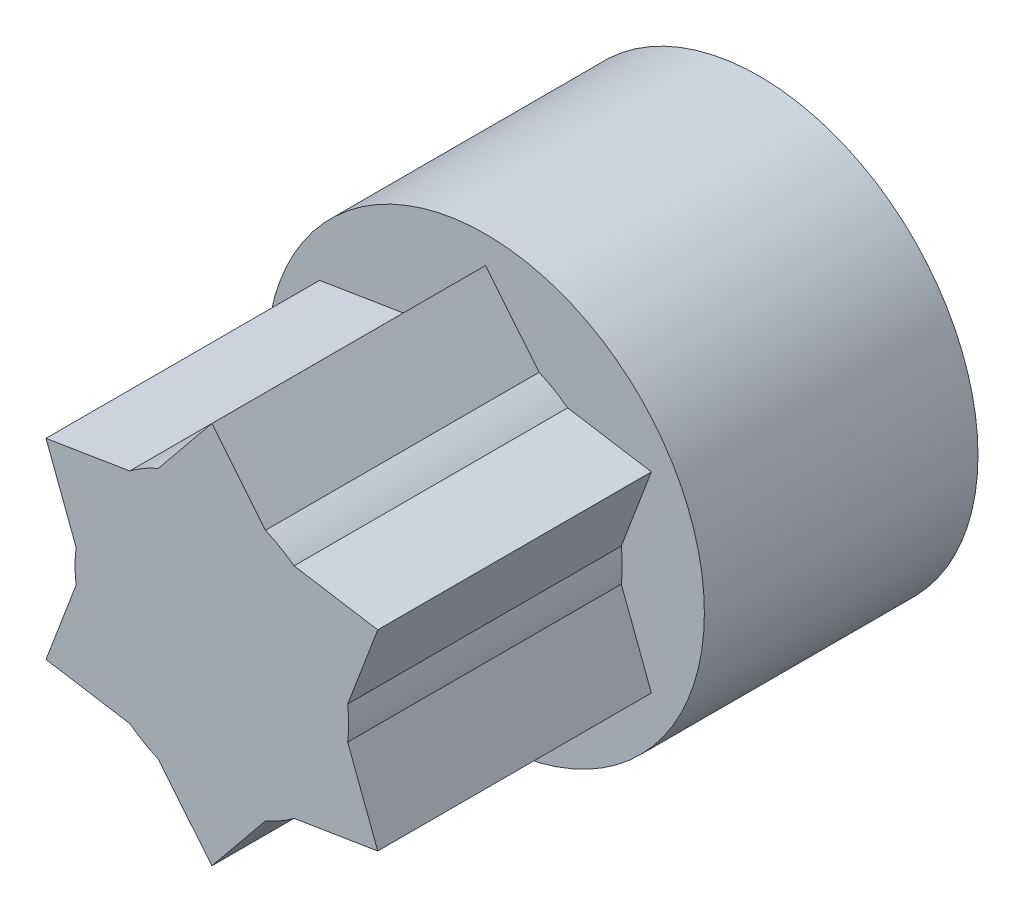
ISO-10303-21;
HEADER;
FILE_DESCRIPTION(('STEP AP214'),'2;1');
FILE_NAME('part.step','',(''),(''),'','','');
FILE_SCHEMA(('AUTOMOTIVE_DESIGN { 1 0 10303 214 1 1 1 1 }'));
ENDSEC;
DATA;
#1=APPLICATION_CONTEXT('core data for automotive mechanical design processes');
#2=APPLICATION_PROTOCOL_DEFINITION('international standard','automotive_design',2000,#1);
#3=PRODUCT_CONTEXT('',#1,'mechanical');
#4=PRODUCT('Part','Part','',(#3));
#5=PRODUCT_RELATED_PRODUCT_CATEGORY('part','',(#4));
#6=PRODUCT_DEFINITION_FORMATION('','',#4);
#7=PRODUCT_DEFINITION_CONTEXT('part definition',#1,'design');
#8=PRODUCT_DEFINITION('design','',#6,#7);
#9=PRODUCT_DEFINITION_SHAPE('','',#8);
#10=(LENGTH_UNIT() NAMED_UNIT(*) SI_UNIT(.MILLI.,.METRE.));
#11=(NAMED_UNIT(*) PLANE_ANGLE_UNIT() SI_UNIT($,.RADIAN.));
#12=(NAMED_UNIT(*) SI_UNIT($,.STERADIAN.) SOLID_ANGLE_UNIT());
#13=UNCERTAINTY_MEASURE_WITH_UNIT(LENGTH_MEASURE(1.E-05),#10,'distance_accuracy_value','');
#14=(GEOMETRIC_REPRESENTATION_CONTEXT(3) GLOBAL_UNCERTAINTY_ASSIGNED_CONTEXT((#13)) GLOBAL_UNIT_ASSIGNED_CONTEXT((#10,
#11,#12)) REPRESENTATION_CONTEXT('',''));
#15=CARTESIAN_POINT('',(0.,0.,0.));
#16=DIRECTION('',(0.,0.,1.));
#17=DIRECTION('',(1.,0.,0.));
#18=AXIS2_PLACEMENT_3D('',#15,#16,#17);
#19=CARTESIAN_POINT('',(-1.71464281994822,1.4,36.602998));
#20=DIRECTION('',(-0.774596669241484,0.632455532033676,0.));
#21=DIRECTION('',(-0.632455532033676,-0.774596669241484,0.));
#22=AXIS2_PLACEMENT_3D('',#19,#20,#21);
#23=PLANE('',#22);
#24=DIRECTION('',(0.632455532033676,0.774596669241483,0.));
#25=VECTOR('',#24,1.);
#26=CARTESIAN_POINT('',(-1.71464281994822,1.4,31.602998));
#27=LINE('',#26,#25);
#28=CARTESIAN_POINT('',(-0.979795897113271,2.3,31.602998));
#29=VERTEX_POINT('',#28);
#30=CARTESIAN_POINT('',(0.,3.5,31.602998));
#31=VERTEX_POINT('',#30);
#32=EDGE_CURVE('E160',#29,#31,#27,.T.);
#33=ORIENTED_EDGE('',*,*,#32,.F.);
#34=DIRECTION('',(0.,0.,-1.));
#35=VECTOR('',#34,1.);
#36=CARTESIAN_POINT('',(-0.979795897113271,2.3,36.602998));
#37=LINE('',#36,#35);
#38=CARTESIAN_POINT('',(-0.979795897113271,2.3,36.602998));
#39=VERTEX_POINT('',#38);
#40=EDGE_CURVE('E11',#39,#29,#37,.T.);
#41=ORIENTED_EDGE('',*,*,#40,.F.);
#42=DIRECTION('',(0.632455532033676,0.774596669241483,0.));
#43=VECTOR('',#42,1.);
#44=CARTESIAN_POINT('',(-1.71464281994822,1.4,36.602998));
#45=LINE('',#44,#43);
#46=CARTESIAN_POINT('',(0.,3.5,36.602998));
#47=VERTEX_POINT('',#46);
#48=EDGE_CURVE('E213',#39,#47,#45,.T.);
#49=ORIENTED_EDGE('',*,*,#48,.T.);
#50=DIRECTION('',(0.,0.,-1.));
#51=VECTOR('',#50,1.);
#52=CARTESIAN_POINT('',(0.,3.5,36.602998));
#53=LINE('',#52,#51);
#54=EDGE_CURVE('E175',#47,#31,#53,.T.);
#55=ORIENTED_EDGE('',*,*,#54,.T.);
#56=EDGE_LOOP('',(#33,#41,#49,#55));
#57=FACE_BOUND('',#56,.T.);
#58=ADVANCED_FACE('F37',(#57),#23,.T.);
#59=CARTESIAN_POINT('',(0.,0.,36.602998));
#60=DIRECTION('',(0.,0.,-1.));
#61=DIRECTION('',(-1.,0.,0.));
#62=AXIS2_PLACEMENT_3D('',#59,#60,#61);
#63=CYLINDRICAL_SURFACE('',#62,2.5);
#64=CARTESIAN_POINT('',(0.,0.,31.602998));
#65=DIRECTION('',(0.,0.,1.));
#66=DIRECTION('',(1.,0.,0.));
#67=AXIS2_PLACEMENT_3D('',#64,#65,#66);
#68=CIRCLE('',#67,2.5);
#69=CARTESIAN_POINT('',(-1.50196048014755,1.99852813742387,31.602998));
#70=VERTEX_POINT('',#69);
#71=EDGE_CURVE('E157',#29,#70,#68,.T.);
#72=ORIENTED_EDGE('',*,*,#71,.T.);
#73=DIRECTION('',(0.,0.,-1.));
#74=VECTOR('',#73,1.);
#75=CARTESIAN_POINT('',(-1.50196048014755,1.99852813742387,36.602998));
#76=LINE('',#75,#74);
#77=CARTESIAN_POINT('',(-1.50196048014755,1.99852813742387,36.602998));
#78=VERTEX_POINT('',#77);
#79=EDGE_CURVE('E45',#78,#70,#76,.T.);
#80=ORIENTED_EDGE('',*,*,#79,.F.);
#81=CARTESIAN_POINT('',(0.,0.,36.602998));
#82=DIRECTION('',(0.,0.,1.));
#83=DIRECTION('',(1.,0.,0.));
#84=AXIS2_PLACEMENT_3D('',#81,#82,#83);
#85=CIRCLE('',#84,2.5);
#86=EDGE_CURVE('E172',#39,#78,#85,.T.);
#87=ORIENTED_EDGE('',*,*,#86,.F.);
#88=ORIENTED_EDGE('',*,*,#40,.T.);
#89=EDGE_LOOP('',(#72,#80,#87,#88));
#90=FACE_BOUND('',#89,.T.);
#91=ADVANCED_FACE('F171',(#90),#63,.T.);
#92=CARTESIAN_POINT('',(-0.355114155324076,2.18492424049175,36.602998));
#93=DIRECTION('',(0.160424222884413,-0.987048159266777,0.));
#94=DIRECTION('',(0.987048159266777,0.160424222884413,0.));
#95=AXIS2_PLACEMENT_3D('',#92,#93,#94);
#96=PLANE('',#95);
#97=DIRECTION('',(-0.987048159266777,-0.160424222884413,0.));
#98=VECTOR('',#97,1.);
#99=CARTESIAN_POINT('',(-0.355114155324076,2.18492424049175,31.602998));
#100=LINE('',#99,#98);
#101=CARTESIAN_POINT('',(-3.03108891324552,1.75000000000004,31.602998));
#102=VERTEX_POINT('',#101);
#103=EDGE_CURVE('E163',#70,#102,#100,.T.);
#104=ORIENTED_EDGE('',*,*,#103,.T.);
#105=DIRECTION('',(0.,0.,-1.));
#106=VECTOR('',#105,1.);
#107=CARTESIAN_POINT('',(-3.03108891324552,1.75000000000004,36.602998));
#108=LINE('',#107,#106);
#109=CARTESIAN_POINT('',(-3.03108891324552,1.75000000000004,36.602998));
#110=VERTEX_POINT('',#109);
#111=EDGE_CURVE('E257',#110,#102,#108,.T.);
#112=ORIENTED_EDGE('',*,*,#111,.F.);
#113=DIRECTION('',(-0.987048159266777,-0.160424222884413,0.));
#114=VECTOR('',#113,1.);
#115=CARTESIAN_POINT('',(-0.355114155324076,2.18492424049175,36.602998));
#116=LINE('',#115,#114);
#117=EDGE_CURVE('E263',#78,#110,#116,.T.);
#118=ORIENTED_EDGE('',*,*,#117,.F.);
#119=ORIENTED_EDGE('',*,*,#79,.T.);
#120=EDGE_LOOP('',(#104,#112,#118,#119));
#121=FACE_BOUND('',#120,.T.);
#122=ADVANCED_FACE('F261',(#121),#96,.F.);
#123=CARTESIAN_POINT('',(-2.06975697527233,-0.784924240491726,36.602998));
#124=DIRECTION('',(-0.935020892125912,-0.354592627233088,0.));
#125=DIRECTION('',(0.354592627233088,-0.935020892125912,0.));
#126=AXIS2_PLACEMENT_3D('',#123,#124,#125);
#127=PLANE('',#126);
#128=DIRECTION('',(-0.354592627233088,0.935020892125912,0.));
#129=VECTOR('',#128,1.);
#130=CARTESIAN_POINT('',(-2.06975697527233,-0.784924240491726,31.602998));
#131=LINE('',#130,#129);
#132=CARTESIAN_POINT('',(-2.48175637726084,0.301471862576172,31.602998));
#133=VERTEX_POINT('',#132);
#134=EDGE_CURVE('E186',#133,#102,#131,.T.);
#135=ORIENTED_EDGE('',*,*,#134,.F.);
#136=DIRECTION('',(0.,0.,-1.));
#137=VECTOR('',#136,1.);
#138=CARTESIAN_POINT('',(-2.48175637726084,0.301471862576172,36.602998));
#139=LINE('',#138,#137);
#140=CARTESIAN_POINT('',(-2.48175637726084,0.301471862576172,36.602998));
#141=VERTEX_POINT('',#140);
#142=EDGE_CURVE('E254',#141,#133,#139,.T.);
#143=ORIENTED_EDGE('',*,*,#142,.F.);
#144=DIRECTION('',(-0.354592627233088,0.935020892125912,0.));
#145=VECTOR('',#144,1.);
#146=CARTESIAN_POINT('',(-2.06975697527233,-0.784924240491726,36.602998));
#147=LINE('',#146,#145);
#148=EDGE_CURVE('E266',#141,#110,#147,.T.);
#149=ORIENTED_EDGE('',*,*,#148,.T.);
#150=ORIENTED_EDGE('',*,*,#111,.T.);
#151=EDGE_LOOP('',(#135,#143,#149,#150));
#152=FACE_BOUND('',#151,.T.);
#153=ADVANCED_FACE('F381',(#152),#127,.T.);
#154=CARTESIAN_POINT('',(-2.48175637726085,-0.30147186257612,31.602998));
#155=VERTEX_POINT('',#154);
#156=EDGE_CURVE('E169',#133,#155,#68,.T.);
#157=ORIENTED_EDGE('',*,*,#156,.T.);
#158=DIRECTION('',(0.,0.,-1.));
#159=VECTOR('',#158,1.);
#160=CARTESIAN_POINT('',(-2.48175637726085,-0.30147186257612,36.602998));
#161=LINE('',#160,#159);
#162=CARTESIAN_POINT('',(-2.48175637726085,-0.30147186257612,36.602998));
#163=VERTEX_POINT('',#162);
#164=EDGE_CURVE('E251',#163,#155,#161,.T.);
#165=ORIENTED_EDGE('',*,*,#164,.F.);
#166=EDGE_CURVE('E268',#141,#163,#85,.T.);
#167=ORIENTED_EDGE('',*,*,#166,.F.);
#168=ORIENTED_EDGE('',*,*,#142,.T.);
#169=EDGE_LOOP('',(#157,#165,#167,#168));
#170=FACE_BOUND('',#169,.T.);
#171=ADVANCED_FACE('F315',(#170),#63,.T.);
#172=CARTESIAN_POINT('',(-2.06975697527232,0.784924240491769,36.602998));
#173=DIRECTION('',(0.935020892125905,-0.354592627233108,0.));
#174=DIRECTION('',(0.354592627233108,0.935020892125905,0.));
#175=AXIS2_PLACEMENT_3D('',#172,#173,#174);
#176=PLANE('',#175);
#177=DIRECTION('',(-0.354592627233108,-0.935020892125904,0.));
#178=VECTOR('',#177,1.);
#179=CARTESIAN_POINT('',(-2.06975697527232,0.784924240491769,31.602998));
#180=LINE('',#179,#178);
#181=CARTESIAN_POINT('',(-3.03108891324555,-1.74999999999997,31.602998));
#182=VERTEX_POINT('',#181);
#183=EDGE_CURVE('E188',#155,#182,#180,.T.);
#184=ORIENTED_EDGE('',*,*,#183,.T.);
#185=DIRECTION('',(0.,0.,-1.));
#186=VECTOR('',#185,1.);
#187=CARTESIAN_POINT('',(-3.03108891324555,-1.74999999999997,36.602998));
#188=LINE('',#187,#186);
#189=CARTESIAN_POINT('',(-3.03108891324555,-1.74999999999997,36.602998));
#190=VERTEX_POINT('',#189);
#191=EDGE_CURVE('E248',#190,#182,#188,.T.);
#192=ORIENTED_EDGE('',*,*,#191,.F.);
#193=DIRECTION('',(-0.354592627233108,-0.935020892125904,0.));
#194=VECTOR('',#193,1.);
#195=CARTESIAN_POINT('',(-2.06975697527232,0.784924240491769,36.602998));
#196=LINE('',#195,#194);
#197=EDGE_CURVE('E274',#163,#190,#196,.T.);
#198=ORIENTED_EDGE('',*,*,#197,.F.);
#199=ORIENTED_EDGE('',*,*,#164,.T.);
#200=EDGE_LOOP('',(#184,#192,#198,#199));
#201=FACE_BOUND('',#200,.T.);
#202=ADVANCED_FACE('F317',(#201),#176,.F.);
#203=CARTESIAN_POINT('',(-0.355114155324123,-2.18492424049175,36.602998));
#204=DIRECTION('',(-0.160424222884434,-0.987048159266773,0.));
#205=DIRECTION('',(0.987048159266773,-0.160424222884434,0.));
#206=AXIS2_PLACEMENT_3D('',#203,#204,#205);
#207=PLANE('',#206);
#208=DIRECTION('',(-0.987048159266773,0.160424222884434,0.));
#209=VECTOR('',#208,1.);
#210=CARTESIAN_POINT('',(-0.355114155324123,-2.18492424049175,31.602998));
#211=LINE('',#210,#209);
#212=CARTESIAN_POINT('',(-1.50196048014759,-1.99852813742384,31.602998));
#213=VERTEX_POINT('',#212);
#214=EDGE_CURVE('E191',#213,#182,#211,.T.);
#215=ORIENTED_EDGE('',*,*,#214,.F.);
#216=DIRECTION('',(0.,0.,-1.));
#217=VECTOR('',#216,1.);
#218=CARTESIAN_POINT('',(-1.50196048014759,-1.99852813742384,36.602998));
#219=LINE('',#218,#217);
#220=CARTESIAN_POINT('',(-1.50196048014759,-1.99852813742384,36.602998));
#221=VERTEX_POINT('',#220);
#222=EDGE_CURVE('E245',#221,#213,#219,.T.);
#223=ORIENTED_EDGE('',*,*,#222,.F.);
#224=DIRECTION('',(-0.987048159266773,0.160424222884434,0.));
#225=VECTOR('',#224,1.);
#226=CARTESIAN_POINT('',(-0.355114155324123,-2.18492424049175,36.602998));
#227=LINE('',#226,#225);
#228=EDGE_CURVE('E276',#221,#190,#227,.T.);
#229=ORIENTED_EDGE('',*,*,#228,.T.);
#230=ORIENTED_EDGE('',*,*,#191,.T.);
#231=EDGE_LOOP('',(#215,#223,#229,#230));
#232=FACE_BOUND('',#231,.T.);
#233=ADVANCED_FACE('F320',(#232),#207,.T.);
#234=CARTESIAN_POINT('',(-0.979795897113287,-2.29999999999999,31.602998));
#235=VERTEX_POINT('',#234);
#236=EDGE_CURVE('E193',#213,#235,#68,.T.);
#237=ORIENTED_EDGE('',*,*,#236,.T.);
#238=DIRECTION('',(0.,0.,-1.));
#239=VECTOR('',#238,1.);
#240=CARTESIAN_POINT('',(-0.979795897113287,-2.29999999999999,36.602998));
#241=LINE('',#240,#239);
#242=CARTESIAN_POINT('',(-0.979795897113287,-2.29999999999999,36.602998));
#243=VERTEX_POINT('',#242);
#244=EDGE_CURVE('E242',#243,#235,#241,.T.);
#245=ORIENTED_EDGE('',*,*,#244,.F.);
#246=EDGE_CURVE('E279',#221,#243,#85,.T.);
#247=ORIENTED_EDGE('',*,*,#246,.F.);
#248=ORIENTED_EDGE('',*,*,#222,.T.);
#249=EDGE_LOOP('',(#237,#245,#247,#248));
#250=FACE_BOUND('',#249,.T.);
#251=ADVANCED_FACE('F323',(#250),#63,.T.);
#252=CARTESIAN_POINT('',(-1.71464281994823,-1.39999999999999,36.602998));
#253=DIRECTION('',(0.774596669241488,0.63245553203367,0.));
#254=DIRECTION('',(-0.63245553203367,0.774596669241488,0.));
#255=AXIS2_PLACEMENT_3D('',#252,#253,#254);
#256=PLANE('',#255);
#257=DIRECTION('',(0.63245553203367,-0.774596669241488,0.));
#258=VECTOR('',#257,1.);
#259=CARTESIAN_POINT('',(-1.71464281994823,-1.39999999999999,31.602998));
#260=LINE('',#259,#258);
#261=CARTESIAN_POINT('',(0.,-3.5,31.602998));
#262=VERTEX_POINT('',#261);
#263=EDGE_CURVE('E194',#235,#262,#260,.T.);
#264=ORIENTED_EDGE('',*,*,#263,.T.);
#265=DIRECTION('',(0.,0.,-1.));
#266=VECTOR('',#265,1.);
#267=CARTESIAN_POINT('',(0.,-3.5,36.602998));
#268=LINE('',#267,#266);
#269=CARTESIAN_POINT('',(0.,-3.5,36.602998));
#270=VERTEX_POINT('',#269);
#271=EDGE_CURVE('E239',#270,#262,#268,.T.);
#272=ORIENTED_EDGE('',*,*,#271,.F.);
#273=DIRECTION('',(0.63245553203367,-0.774596669241488,0.));
#274=VECTOR('',#273,1.);
#275=CARTESIAN_POINT('',(-1.71464281994823,-1.39999999999999,36.602998));
#276=LINE('',#275,#274);
#277=EDGE_CURVE('E280',#243,#270,#276,.T.);
#278=ORIENTED_EDGE('',*,*,#277,.F.);
#279=ORIENTED_EDGE('',*,*,#244,.T.);
#280=EDGE_LOOP('',(#264,#272,#278,#279));
#281=FACE_BOUND('',#280,.T.);
#282=ADVANCED_FACE('F327',(#281),#256,.F.);
#283=CARTESIAN_POINT('',(1.71464281994821,-1.40000000000001,36.602998));
#284=DIRECTION('',(0.774596669241479,-0.632455532033681,0.));
#285=DIRECTION('',(0.632455532033681,0.774596669241479,0.));
#286=AXIS2_PLACEMENT_3D('',#283,#284,#285);
#287=PLANE('',#286);
#288=DIRECTION('',(-0.632455532033681,-0.774596669241479,0.));
#289=VECTOR('',#288,1.);
#290=CARTESIAN_POINT('',(1.71464281994821,-1.40000000000001,31.602998));
#291=LINE('',#290,#289);
#292=CARTESIAN_POINT('',(0.979795897113255,-2.30000000000001,31.602998));
#293=VERTEX_POINT('',#292);
#294=EDGE_CURVE('E197',#293,#262,#291,.T.);
#295=ORIENTED_EDGE('',*,*,#294,.F.);
#296=DIRECTION('',(0.,0.,-1.));
#297=VECTOR('',#296,1.);
#298=CARTESIAN_POINT('',(0.979795897113255,-2.30000000000001,36.602998));
#299=LINE('',#298,#297);
#300=CARTESIAN_POINT('',(0.979795897113255,-2.30000000000001,36.602998));
#301=VERTEX_POINT('',#300);
#302=EDGE_CURVE('E236',#301,#293,#299,.T.);
#303=ORIENTED_EDGE('',*,*,#302,.F.);
#304=DIRECTION('',(-0.632455532033681,-0.774596669241479,0.));
#305=VECTOR('',#304,1.);
#306=CARTESIAN_POINT('',(1.71464281994821,-1.40000000000001,36.602998));
#307=LINE('',#306,#305);
#308=EDGE_CURVE('E282',#301,#270,#307,.T.);
#309=ORIENTED_EDGE('',*,*,#308,.T.);
#310=ORIENTED_EDGE('',*,*,#271,.T.);
#311=EDGE_LOOP('',(#295,#303,#309,#310));
#312=FACE_BOUND('',#311,.T.);
#313=ADVANCED_FACE('F330',(#312),#287,.T.);
#314=CARTESIAN_POINT('',(1.50196048014756,-1.99852813742386,31.602998));
#315=VERTEX_POINT('',#314);
#316=EDGE_CURVE('E199',#293,#315,#68,.T.);
#317=ORIENTED_EDGE('',*,*,#316,.T.);
#318=DIRECTION('',(0.,0.,-1.));
#319=VECTOR('',#318,1.);
#320=CARTESIAN_POINT('',(1.50196048014756,-1.99852813742386,36.602998));
#321=LINE('',#320,#319);
#322=CARTESIAN_POINT('',(1.50196048014756,-1.99852813742386,36.602998));
#323=VERTEX_POINT('',#322);
#324=EDGE_CURVE('E233',#323,#315,#321,.T.);
#325=ORIENTED_EDGE('',*,*,#324,.F.);
#326=EDGE_CURVE('E285',#301,#323,#85,.T.);
#327=ORIENTED_EDGE('',*,*,#326,.F.);
#328=ORIENTED_EDGE('',*,*,#302,.T.);
#329=EDGE_LOOP('',(#317,#325,#327,#328));
#330=FACE_BOUND('',#329,.T.);
#331=ADVANCED_FACE('F333',(#330),#63,.T.);
#332=CARTESIAN_POINT('',(0.355114155324092,-2.18492424049175,36.602998));
#333=DIRECTION('',(-0.16042422288442,0.987048159266776,0.));
#334=DIRECTION('',(-0.987048159266776,-0.16042422288442,0.));
#335=AXIS2_PLACEMENT_3D('',#332,#333,#334);
#336=PLANE('',#335);
#337=DIRECTION('',(0.987048159266776,0.16042422288442,0.));
#338=VECTOR('',#337,1.);
#339=CARTESIAN_POINT('',(0.355114155324092,-2.18492424049175,31.602998));
#340=LINE('',#339,#338);
#341=CARTESIAN_POINT('',(3.03108891324553,-1.75000000000001,31.602998));
#342=VERTEX_POINT('',#341);
#343=EDGE_CURVE('E200',#315,#342,#340,.T.);
#344=ORIENTED_EDGE('',*,*,#343,.T.);
#345=DIRECTION('',(0.,0.,-1.));
#346=VECTOR('',#345,1.);
#347=CARTESIAN_POINT('',(3.03108891324553,-1.75000000000001,36.602998));
#348=LINE('',#347,#346);
#349=CARTESIAN_POINT('',(3.03108891324553,-1.75000000000001,36.602998));
#350=VERTEX_POINT('',#349);
#351=EDGE_CURVE('E230',#350,#342,#348,.T.);
#352=ORIENTED_EDGE('',*,*,#351,.F.);
#353=DIRECTION('',(0.987048159266776,0.16042422288442,0.));
#354=VECTOR('',#353,1.);
#355=CARTESIAN_POINT('',(0.355114155324092,-2.18492424049175,36.602998));
#356=LINE('',#355,#354);
#357=EDGE_CURVE('E286',#323,#350,#356,.T.);
#358=ORIENTED_EDGE('',*,*,#357,.F.);
#359=ORIENTED_EDGE('',*,*,#324,.T.);
#360=EDGE_LOOP('',(#344,#352,#358,#359));
#361=FACE_BOUND('',#360,.T.);
#362=ADVANCED_FACE('F337',(#361),#336,.F.);
#363=CARTESIAN_POINT('',(2.06975697527233,0.78492424049174,36.602998));
#364=DIRECTION('',(0.93502089212591,0.354592627233094,0.));
#365=DIRECTION('',(-0.354592627233094,0.93502089212591,0.));
#366=AXIS2_PLACEMENT_3D('',#363,#364,#365);
#367=PLANE('',#366);
#368=DIRECTION('',(0.354592627233094,-0.93502089212591,0.));
#369=VECTOR('',#368,1.);
#370=CARTESIAN_POINT('',(2.06975697527233,0.78492424049174,31.602998));
#371=LINE('',#370,#369);
#372=CARTESIAN_POINT('',(2.48175637726084,-0.301471862576154,31.602998));
#373=VERTEX_POINT('',#372);
#374=EDGE_CURVE('E203',#373,#342,#371,.T.);
#375=ORIENTED_EDGE('',*,*,#374,.F.);
#376=DIRECTION('',(0.,0.,-1.));
#377=VECTOR('',#376,1.);
#378=CARTESIAN_POINT('',(2.48175637726084,-0.301471862576154,36.602998));
#379=LINE('',#378,#377);
#380=CARTESIAN_POINT('',(2.48175637726084,-0.301471862576154,36.602998));
#381=VERTEX_POINT('',#380);
#382=EDGE_CURVE('E227',#381,#373,#379,.T.);
#383=ORIENTED_EDGE('',*,*,#382,.F.);
#384=DIRECTION('',(0.354592627233094,-0.93502089212591,0.));
#385=VECTOR('',#384,1.);
#386=CARTESIAN_POINT('',(2.06975697527233,0.78492424049174,36.602998));
#387=LINE('',#386,#385);
#388=EDGE_CURVE('E288',#381,#350,#387,.T.);
#389=ORIENTED_EDGE('',*,*,#388,.T.);
#390=ORIENTED_EDGE('',*,*,#351,.T.);
#391=EDGE_LOOP('',(#375,#383,#389,#390));
#392=FACE_BOUND('',#391,.T.);
#393=ADVANCED_FACE('F340',(#392),#367,.T.);
#394=CARTESIAN_POINT('',(2.48175637726084,0.301471862576137,31.602998));
#395=VERTEX_POINT('',#394);
#396=EDGE_CURVE('E205',#373,#395,#68,.T.);
#397=ORIENTED_EDGE('',*,*,#396,.T.);
#398=DIRECTION('',(0.,0.,-1.));
#399=VECTOR('',#398,1.);
#400=CARTESIAN_POINT('',(2.48175637726084,0.301471862576137,36.602998));
#401=LINE('',#400,#399);
#402=CARTESIAN_POINT('',(2.48175637726084,0.301471862576137,36.602998));
#403=VERTEX_POINT('',#402);
#404=EDGE_CURVE('E224',#403,#395,#401,.T.);
#405=ORIENTED_EDGE('',*,*,#404,.F.);
#406=EDGE_CURVE('E291',#381,#403,#85,.T.);
#407=ORIENTED_EDGE('',*,*,#406,.F.);
#408=ORIENTED_EDGE('',*,*,#382,.T.);
#409=EDGE_LOOP('',(#397,#405,#407,#408));
#410=FACE_BOUND('',#409,.T.);
#411=ADVANCED_FACE('F343',(#410),#63,.T.);
#412=CARTESIAN_POINT('',(2.06975697527232,-0.784924240491755,36.602998));
#413=DIRECTION('',(-0.935020892125907,0.354592627233101,0.));
#414=DIRECTION('',(-0.354592627233101,-0.935020892125907,0.));
#415=AXIS2_PLACEMENT_3D('',#412,#413,#414);
#416=PLANE('',#415);
#417=DIRECTION('',(0.354592627233101,0.935020892125907,0.));
#418=VECTOR('',#417,1.);
#419=CARTESIAN_POINT('',(2.06975697527232,-0.784924240491755,31.602998));
#420=LINE('',#419,#418);
#421=CARTESIAN_POINT('',(3.03108891324554,1.74999999999999,31.602998));
#422=VERTEX_POINT('',#421);
#423=EDGE_CURVE('E206',#395,#422,#420,.T.);
#424=ORIENTED_EDGE('',*,*,#423,.T.);
#425=DIRECTION('',(0.,0.,-1.));
#426=VECTOR('',#425,1.);
#427=CARTESIAN_POINT('',(3.03108891324554,1.74999999999999,36.602998));
#428=LINE('',#427,#426);
#429=CARTESIAN_POINT('',(3.03108891324554,1.74999999999999,36.602998));
#430=VERTEX_POINT('',#429);
#431=EDGE_CURVE('E221',#430,#422,#428,.T.);
#432=ORIENTED_EDGE('',*,*,#431,.F.);
#433=DIRECTION('',(0.354592627233101,0.935020892125907,0.));
#434=VECTOR('',#433,1.);
#435=CARTESIAN_POINT('',(2.06975697527232,-0.784924240491755,36.602998));
#436=LINE('',#435,#434);
#437=EDGE_CURVE('E292',#403,#430,#436,.T.);
#438=ORIENTED_EDGE('',*,*,#437,.F.);
#439=ORIENTED_EDGE('',*,*,#404,.T.);
#440=EDGE_LOOP('',(#424,#432,#438,#439));
#441=FACE_BOUND('',#440,.T.);
#442=ADVANCED_FACE('F347',(#441),#416,.F.);
#443=CARTESIAN_POINT('',(0.355114155324107,2.18492424049175,36.602998));
#444=DIRECTION('',(0.160424222884427,0.987048159266774,0.));
#445=DIRECTION('',(-0.987048159266774,0.160424222884427,0.));
#446=AXIS2_PLACEMENT_3D('',#443,#444,#445);
#447=PLANE('',#446);
#448=DIRECTION('',(0.987048159266774,-0.160424222884427,0.));
#449=VECTOR('',#448,1.);
#450=CARTESIAN_POINT('',(0.355114155324107,2.18492424049175,31.602998));
#451=LINE('',#450,#449);
#452=CARTESIAN_POINT('',(1.50196048014758,1.99852813742385,31.602998));
#453=VERTEX_POINT('',#452);
#454=EDGE_CURVE('E209',#453,#422,#451,.T.);
#455=ORIENTED_EDGE('',*,*,#454,.F.);
#456=DIRECTION('',(0.,0.,-1.));
#457=VECTOR('',#456,1.);
#458=CARTESIAN_POINT('',(1.50196048014758,1.99852813742385,36.602998));
#459=LINE('',#458,#457);
#460=CARTESIAN_POINT('',(1.50196048014758,1.99852813742385,36.602998));
#461=VERTEX_POINT('',#460);
#462=EDGE_CURVE('E218',#461,#453,#459,.T.);
#463=ORIENTED_EDGE('',*,*,#462,.F.);
#464=DIRECTION('',(0.987048159266774,-0.160424222884427,0.));
#465=VECTOR('',#464,1.);
#466=CARTESIAN_POINT('',(0.355114155324107,2.18492424049175,36.602998));
#467=LINE('',#466,#465);
#468=EDGE_CURVE('E293',#461,#430,#467,.T.);
#469=ORIENTED_EDGE('',*,*,#468,.T.);
#470=ORIENTED_EDGE('',*,*,#431,.T.);
#471=EDGE_LOOP('',(#455,#463,#469,#470));
#472=FACE_BOUND('',#471,.T.);
#473=ADVANCED_FACE('F349',(#472),#447,.T.);
#474=CARTESIAN_POINT('',(0.979795897113271,2.3,31.602998));
#475=VERTEX_POINT('',#474);
#476=EDGE_CURVE('E168',#453,#475,#68,.T.);
#477=ORIENTED_EDGE('',*,*,#476,.T.);
#478=DIRECTION('',(0.,0.,-1.));
#479=VECTOR('',#478,1.);
#480=CARTESIAN_POINT('',(0.979795897113271,2.3,36.602998));
#481=LINE('',#480,#479);
#482=CARTESIAN_POINT('',(0.979795897113271,2.3,36.602998));
#483=VERTEX_POINT('',#482);
#484=EDGE_CURVE('E215',#483,#475,#481,.T.);
#485=ORIENTED_EDGE('',*,*,#484,.F.);
#486=EDGE_CURVE('E271',#461,#483,#85,.T.);
#487=ORIENTED_EDGE('',*,*,#486,.F.);
#488=ORIENTED_EDGE('',*,*,#462,.T.);
#489=EDGE_LOOP('',(#477,#485,#487,#488));
#490=FACE_BOUND('',#489,.T.);
#491=ADVANCED_FACE('F352',(#490),#63,.T.);
#492=CARTESIAN_POINT('',(1.71464281994822,1.4,36.602998));
#493=DIRECTION('',(-0.774596669241484,-0.632455532033676,0.));
#494=DIRECTION('',(0.632455532033676,-0.774596669241484,0.));
#495=AXIS2_PLACEMENT_3D('',#492,#493,#494);
#496=PLANE('',#495);
#497=DIRECTION('',(-0.632455532033676,0.774596669241483,0.));
#498=VECTOR('',#497,1.);
#499=CARTESIAN_POINT('',(1.71464281994822,1.4,31.602998));
#500=LINE('',#499,#498);
#501=EDGE_CURVE('E211',#475,#31,#500,.T.);
#502=ORIENTED_EDGE('',*,*,#501,.T.);
#503=ORIENTED_EDGE('',*,*,#54,.F.);
#504=DIRECTION('',(-0.632455532033676,0.774596669241483,0.));
#505=VECTOR('',#504,1.);
#506=CARTESIAN_POINT('',(1.71464281994822,1.4,36.602998));
#507=LINE('',#506,#505);
#508=EDGE_CURVE('E52',#483,#47,#507,.T.);
#509=ORIENTED_EDGE('',*,*,#508,.F.);
#510=ORIENTED_EDGE('',*,*,#484,.T.);
#511=EDGE_LOOP('',(#502,#503,#509,#510));
#512=FACE_BOUND('',#511,.T.);
#513=ADVANCED_FACE('F354',(#512),#496,.F.);
#514=CARTESIAN_POINT('',(0.,0.,36.602998));
#515=DIRECTION('',(0.,0.,1.));
#516=DIRECTION('',(1.,0.,0.));
#517=AXIS2_PLACEMENT_3D('',#514,#515,#516);
#518=PLANE('',#517);
#519=ORIENTED_EDGE('',*,*,#48,.F.);
#520=ORIENTED_EDGE('',*,*,#86,.T.);
#521=ORIENTED_EDGE('',*,*,#117,.T.);
#522=ORIENTED_EDGE('',*,*,#148,.F.);
#523=ORIENTED_EDGE('',*,*,#166,.T.);
#524=ORIENTED_EDGE('',*,*,#197,.T.);
#525=ORIENTED_EDGE('',*,*,#228,.F.);
#526=ORIENTED_EDGE('',*,*,#246,.T.);
#527=ORIENTED_EDGE('',*,*,#277,.T.);
#528=ORIENTED_EDGE('',*,*,#308,.F.);
#529=ORIENTED_EDGE('',*,*,#326,.T.);
#530=ORIENTED_EDGE('',*,*,#357,.T.);
#531=ORIENTED_EDGE('',*,*,#388,.F.);
#532=ORIENTED_EDGE('',*,*,#406,.T.);
#533=ORIENTED_EDGE('',*,*,#437,.T.);
#534=ORIENTED_EDGE('',*,*,#468,.F.);
#535=ORIENTED_EDGE('',*,*,#486,.T.);
#536=ORIENTED_EDGE('',*,*,#508,.T.);
#537=EDGE_LOOP('',(#519,#520,#521,#522,#523,#524,#525,#526,#527,#528,#529,#530,#531,#532,#533,
#534,#535,#536));
#538=FACE_BOUND('',#537,.T.);
#539=ADVANCED_FACE('F310',(#538),#518,.T.);
#540=CARTESIAN_POINT('',(0.,0.,31.602998));
#541=DIRECTION('',(0.,0.,1.));
#542=DIRECTION('',(1.,0.,0.));
#543=AXIS2_PLACEMENT_3D('',#540,#541,#542);
#544=PLANE('',#543);
#545=CARTESIAN_POINT('',(0.,0.,31.602998));
#546=DIRECTION('',(0.,0.,1.));
#547=DIRECTION('',(1.,0.,0.));
#548=AXIS2_PLACEMENT_3D('',#545,#546,#547);
#549=CIRCLE('',#548,4.);
#550=CARTESIAN_POINT('',(4.,0.,31.602998));
#551=VERTEX_POINT('',#550);
#552=EDGE_CURVE('E180',#551,#551,#549,.T.);
#553=ORIENTED_EDGE('',*,*,#552,.T.);
#554=EDGE_LOOP('',(#553));
#555=FACE_BOUND('',#554,.T.);
#556=ORIENTED_EDGE('',*,*,#71,.F.);
#557=ORIENTED_EDGE('',*,*,#32,.T.);
#558=ORIENTED_EDGE('',*,*,#501,.F.);
#559=ORIENTED_EDGE('',*,*,#476,.F.);
#560=ORIENTED_EDGE('',*,*,#454,.T.);
#561=ORIENTED_EDGE('',*,*,#423,.F.);
#562=ORIENTED_EDGE('',*,*,#396,.F.);
#563=ORIENTED_EDGE('',*,*,#374,.T.);
#564=ORIENTED_EDGE('',*,*,#343,.F.);
#565=ORIENTED_EDGE('',*,*,#316,.F.);
#566=ORIENTED_EDGE('',*,*,#294,.T.);
#567=ORIENTED_EDGE('',*,*,#263,.F.);
#568=ORIENTED_EDGE('',*,*,#236,.F.);
#569=ORIENTED_EDGE('',*,*,#214,.T.);
#570=ORIENTED_EDGE('',*,*,#183,.F.);
#571=ORIENTED_EDGE('',*,*,#156,.F.);
#572=ORIENTED_EDGE('',*,*,#134,.T.);
#573=ORIENTED_EDGE('',*,*,#103,.F.);
#574=EDGE_LOOP('',(#556,#557,#558,#559,#560,#561,#562,#563,#564,#565,#566,#567,#568,#569,#570,
#571,#572,#573));
#575=FACE_BOUND('',#574,.T.);
#576=ADVANCED_FACE('F158',(#555,#575),#544,.T.);
#577=CARTESIAN_POINT('',(0.,0.,26.602998));
#578=DIRECTION('',(0.,0.,1.));
#579=DIRECTION('',(1.,0.,0.));
#580=AXIS2_PLACEMENT_3D('',#577,#578,#579);
#581=CYLINDRICAL_SURFACE('',#580,4.);
#582=CARTESIAN_POINT('',(0.,0.,26.602998));
#583=DIRECTION('',(0.,0.,1.));
#584=DIRECTION('',(1.,0.,0.));
#585=AXIS2_PLACEMENT_3D('',#582,#583,#584);
#586=CIRCLE('',#585,4.);
#587=CARTESIAN_POINT('',(4.,0.,26.602998));
#588=VERTEX_POINT('',#587);
#589=EDGE_CURVE('E177',#588,#588,#586,.T.);
#590=ORIENTED_EDGE('',*,*,#589,.T.);
#591=EDGE_LOOP('',(#590));
#592=FACE_BOUND('',#591,.T.);
#593=ORIENTED_EDGE('',*,*,#552,.F.);
#594=EDGE_LOOP('',(#593));
#595=FACE_BOUND('',#594,.T.);
#596=ADVANCED_FACE('F360',(#592,#595),#581,.T.);
#597=CARTESIAN_POINT('',(0.,0.,26.602998));
#598=DIRECTION('',(0.,0.,1.));
#599=DIRECTION('',(1.,0.,0.));
#600=AXIS2_PLACEMENT_3D('',#597,#598,#599);
#601=PLANE('',#600);
#602=ORIENTED_EDGE('',*,*,#589,.F.);
#603=EDGE_LOOP('',(#602));
#604=FACE_BOUND('',#603,.T.);
#605=ADVANCED_FACE('F362',(#604),#601,.F.);
#606=CLOSED_SHELL('',(#58,#91,#122,#153,#171,#202,#233,#251,#282,#313,#331,#362,#393,#411,#442,
#473,#491,#513,#539,#576,#596,#605));
#607=MANIFOLD_SOLID_BREP('B2',#606);
#608=ADVANCED_BREP_SHAPE_REPRESENTATION('',(#18,#607),#14);
#609=SHAPE_DEFINITION_REPRESENTATION(#9,#608);
ENDSEC;
END-ISO-10303-21;
